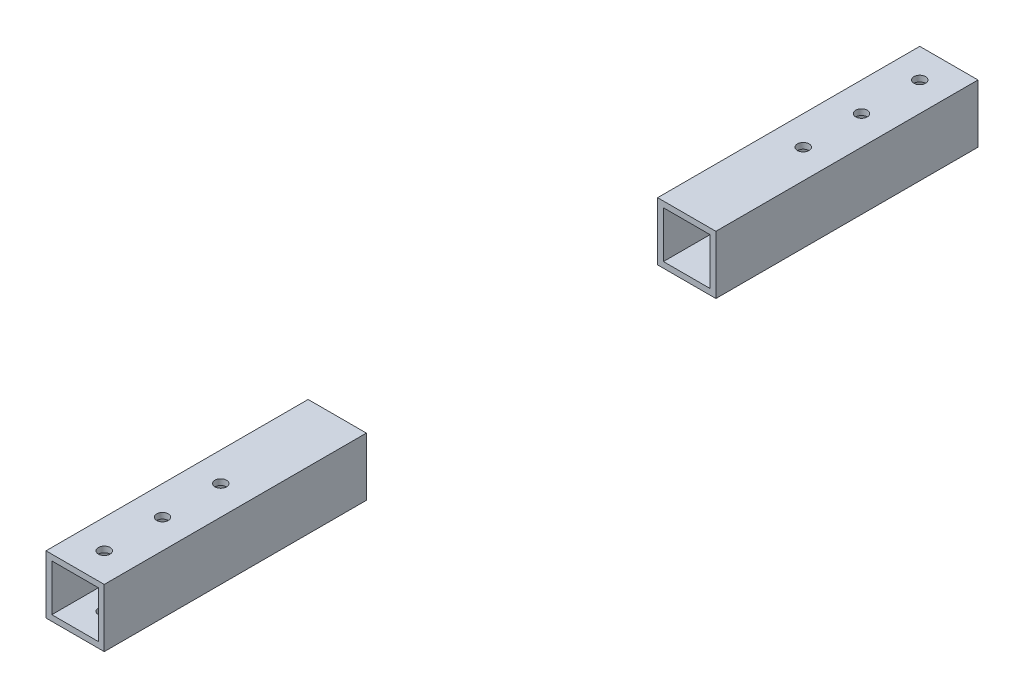
ISO-10303-21;
HEADER;
FILE_DESCRIPTION(('STEP AP214'),'2;1');
FILE_NAME('part.step','',(''),(''),'','','');
FILE_SCHEMA(('AUTOMOTIVE_DESIGN { 1 0 10303 214 1 1 1 1 }'));
ENDSEC;
DATA;
#1=APPLICATION_CONTEXT('core data for automotive mechanical design processes');
#2=APPLICATION_PROTOCOL_DEFINITION('international standard','automotive_design',2000,#1);
#3=PRODUCT_CONTEXT('',#1,'mechanical');
#4=PRODUCT('Part','Part','',(#3));
#5=PRODUCT_RELATED_PRODUCT_CATEGORY('part','',(#4));
#6=PRODUCT_DEFINITION_FORMATION('','',#4);
#7=PRODUCT_DEFINITION_CONTEXT('part definition',#1,'design');
#8=PRODUCT_DEFINITION('design','',#6,#7);
#9=PRODUCT_DEFINITION_SHAPE('','',#8);
#10=(LENGTH_UNIT() NAMED_UNIT(*) SI_UNIT(.MILLI.,.METRE.));
#11=(NAMED_UNIT(*) PLANE_ANGLE_UNIT() SI_UNIT($,.RADIAN.));
#12=(NAMED_UNIT(*) SI_UNIT($,.STERADIAN.) SOLID_ANGLE_UNIT());
#13=UNCERTAINTY_MEASURE_WITH_UNIT(LENGTH_MEASURE(1.E-05),#10,'distance_accuracy_value','');
#14=(GEOMETRIC_REPRESENTATION_CONTEXT(3) GLOBAL_UNCERTAINTY_ASSIGNED_CONTEXT((#13)) GLOBAL_UNIT_ASSIGNED_CONTEXT((#10,
#11,#12)) REPRESENTATION_CONTEXT('',''));
#15=CARTESIAN_POINT('',(0.,0.,0.));
#16=DIRECTION('',(0.,0.,1.));
#17=DIRECTION('',(1.,0.,0.));
#18=AXIS2_PLACEMENT_3D('',#15,#16,#17);
#19=CARTESIAN_POINT('',(0.,0.,300.));
#20=DIRECTION('',(1.,0.,0.));
#21=DIRECTION('',(0.,0.,-1.));
#22=AXIS2_PLACEMENT_3D('',#19,#20,#21);
#23=PLANE('',#22);
#24=DIRECTION('',(0.,0.,-1.));
#25=VECTOR('',#24,1.);
#26=CARTESIAN_POINT('',(0.,0.,300.));
#27=LINE('',#26,#25);
#28=CARTESIAN_POINT('',(0.,0.,90.));
#29=VERTEX_POINT('',#28);
#30=CARTESIAN_POINT('',(0.,0.,0.));
#31=VERTEX_POINT('',#30);
#32=EDGE_CURVE('E152',#29,#31,#27,.T.);
#33=ORIENTED_EDGE('',*,*,#32,.F.);
#34=DIRECTION('',(0.,1.,0.));
#35=VECTOR('',#34,1.);
#36=CARTESIAN_POINT('',(0.,0.,90.));
#37=LINE('',#36,#35);
#38=CARTESIAN_POINT('',(0.,20.,90.));
#39=VERTEX_POINT('',#38);
#40=EDGE_CURVE('E139',#29,#39,#37,.T.);
#41=ORIENTED_EDGE('',*,*,#40,.T.);
#42=DIRECTION('',(0.,0.,-1.));
#43=VECTOR('',#42,1.);
#44=CARTESIAN_POINT('',(0.,20.,300.));
#45=LINE('',#44,#43);
#46=CARTESIAN_POINT('',(0.,20.,0.));
#47=VERTEX_POINT('',#46);
#48=EDGE_CURVE('E146',#39,#47,#45,.T.);
#49=ORIENTED_EDGE('',*,*,#48,.T.);
#50=DIRECTION('',(0.,-1.,0.));
#51=VECTOR('',#50,1.);
#52=CARTESIAN_POINT('',(0.,0.,0.));
#53=LINE('',#52,#51);
#54=EDGE_CURVE('E159',#47,#31,#53,.T.);
#55=ORIENTED_EDGE('',*,*,#54,.T.);
#56=EDGE_LOOP('',(#33,#41,#49,#55));
#57=FACE_BOUND('',#56,.T.);
#58=ADVANCED_FACE('F80',(#57),#23,.F.);
#59=CARTESIAN_POINT('',(0.,0.,300.));
#60=DIRECTION('',(0.,1.,0.));
#61=DIRECTION('',(0.,0.,1.));
#62=AXIS2_PLACEMENT_3D('',#59,#60,#61);
#63=PLANE('',#62);
#64=CARTESIAN_POINT('',(10.,0.,10.));
#65=DIRECTION('',(0.,1.,0.));
#66=DIRECTION('',(0.,0.,-1.));
#67=AXIS2_PLACEMENT_3D('',#64,#65,#66);
#68=CIRCLE('',#67,2.);
#69=CARTESIAN_POINT('',(10.,0.,8.00000000000001));
#70=VERTEX_POINT('',#69);
#71=EDGE_CURVE('E209',#70,#70,#68,.T.);
#72=ORIENTED_EDGE('',*,*,#71,.T.);
#73=EDGE_LOOP('',(#72));
#74=FACE_BOUND('',#73,.T.);
#75=CARTESIAN_POINT('',(10.,0.,30.));
#76=DIRECTION('',(0.,1.,0.));
#77=DIRECTION('',(0.,0.,-1.));
#78=AXIS2_PLACEMENT_3D('',#75,#76,#77);
#79=CIRCLE('',#78,2.);
#80=CARTESIAN_POINT('',(10.,0.,28.));
#81=VERTEX_POINT('',#80);
#82=EDGE_CURVE('E206',#81,#81,#79,.T.);
#83=ORIENTED_EDGE('',*,*,#82,.T.);
#84=EDGE_LOOP('',(#83));
#85=FACE_BOUND('',#84,.T.);
#86=CARTESIAN_POINT('',(10.,0.,50.));
#87=DIRECTION('',(0.,1.,0.));
#88=DIRECTION('',(0.,0.,-1.));
#89=AXIS2_PLACEMENT_3D('',#86,#87,#88);
#90=CIRCLE('',#89,2.);
#91=CARTESIAN_POINT('',(10.,0.,48.));
#92=VERTEX_POINT('',#91);
#93=EDGE_CURVE('E155',#92,#92,#90,.T.);
#94=ORIENTED_EDGE('',*,*,#93,.T.);
#95=EDGE_LOOP('',(#94));
#96=FACE_BOUND('',#95,.T.);
#97=DIRECTION('',(0.,0.,-1.));
#98=VECTOR('',#97,1.);
#99=CARTESIAN_POINT('',(20.,0.,300.));
#100=LINE('',#99,#98);
#101=CARTESIAN_POINT('',(20.,0.,90.));
#102=VERTEX_POINT('',#101);
#103=CARTESIAN_POINT('',(20.,0.,0.));
#104=VERTEX_POINT('',#103);
#105=EDGE_CURVE('E154',#102,#104,#100,.T.);
#106=ORIENTED_EDGE('',*,*,#105,.F.);
#107=DIRECTION('',(-1.,0.,0.));
#108=VECTOR('',#107,1.);
#109=CARTESIAN_POINT('',(0.,0.,90.));
#110=LINE('',#109,#108);
#111=EDGE_CURVE('E142',#102,#29,#110,.T.);
#112=ORIENTED_EDGE('',*,*,#111,.T.);
#113=ORIENTED_EDGE('',*,*,#32,.T.);
#114=DIRECTION('',(1.,0.,0.));
#115=VECTOR('',#114,1.);
#116=CARTESIAN_POINT('',(0.,0.,0.));
#117=LINE('',#116,#115);
#118=EDGE_CURVE('E160',#31,#104,#117,.T.);
#119=ORIENTED_EDGE('',*,*,#118,.T.);
#120=EDGE_LOOP('',(#106,#112,#113,#119));
#121=FACE_BOUND('',#120,.T.);
#122=ADVANCED_FACE('F150',(#74,#85,#96,#121),#63,.F.);
#123=CARTESIAN_POINT('',(20.,0.,300.));
#124=DIRECTION('',(-1.,0.,0.));
#125=DIRECTION('',(0.,0.,1.));
#126=AXIS2_PLACEMENT_3D('',#123,#124,#125);
#127=PLANE('',#126);
#128=DIRECTION('',(0.,0.,-1.));
#129=VECTOR('',#128,1.);
#130=CARTESIAN_POINT('',(20.,20.,300.));
#131=LINE('',#130,#129);
#132=CARTESIAN_POINT('',(20.,20.,90.));
#133=VERTEX_POINT('',#132);
#134=CARTESIAN_POINT('',(20.,20.,0.));
#135=VERTEX_POINT('',#134);
#136=EDGE_CURVE('E167',#133,#135,#131,.T.);
#137=ORIENTED_EDGE('',*,*,#136,.F.);
#138=DIRECTION('',(0.,1.,0.));
#139=VECTOR('',#138,1.);
#140=CARTESIAN_POINT('',(20.,0.,90.));
#141=LINE('',#140,#139);
#142=EDGE_CURVE('E13',#102,#133,#141,.T.);
#143=ORIENTED_EDGE('',*,*,#142,.F.);
#144=ORIENTED_EDGE('',*,*,#105,.T.);
#145=DIRECTION('',(0.,1.,0.));
#146=VECTOR('',#145,1.);
#147=CARTESIAN_POINT('',(20.,0.,0.));
#148=LINE('',#147,#146);
#149=EDGE_CURVE('E166',#104,#135,#148,.T.);
#150=ORIENTED_EDGE('',*,*,#149,.T.);
#151=EDGE_LOOP('',(#137,#143,#144,#150));
#152=FACE_BOUND('',#151,.T.);
#153=ADVANCED_FACE('F264',(#152),#127,.F.);
#154=CARTESIAN_POINT('',(0.,20.,300.));
#155=DIRECTION('',(0.,-1.,0.));
#156=DIRECTION('',(0.,0.,-1.));
#157=AXIS2_PLACEMENT_3D('',#154,#155,#156);
#158=PLANE('',#157);
#159=CARTESIAN_POINT('',(10.,20.,10.));
#160=DIRECTION('',(0.,1.,0.));
#161=DIRECTION('',(0.,0.,-1.));
#162=AXIS2_PLACEMENT_3D('',#159,#160,#161);
#163=CIRCLE('',#162,2.);
#164=CARTESIAN_POINT('',(10.,20.,8.00000000000001));
#165=VERTEX_POINT('',#164);
#166=EDGE_CURVE('E217',#165,#165,#163,.T.);
#167=ORIENTED_EDGE('',*,*,#166,.F.);
#168=EDGE_LOOP('',(#167));
#169=FACE_BOUND('',#168,.T.);
#170=CARTESIAN_POINT('',(10.,20.,30.));
#171=DIRECTION('',(0.,1.,0.));
#172=DIRECTION('',(0.,0.,-1.));
#173=AXIS2_PLACEMENT_3D('',#170,#171,#172);
#174=CIRCLE('',#173,2.);
#175=CARTESIAN_POINT('',(10.,20.,28.));
#176=VERTEX_POINT('',#175);
#177=EDGE_CURVE('E210',#176,#176,#174,.T.);
#178=ORIENTED_EDGE('',*,*,#177,.F.);
#179=EDGE_LOOP('',(#178));
#180=FACE_BOUND('',#179,.T.);
#181=CARTESIAN_POINT('',(10.,20.,50.));
#182=DIRECTION('',(0.,1.,0.));
#183=DIRECTION('',(0.,0.,-1.));
#184=AXIS2_PLACEMENT_3D('',#181,#182,#183);
#185=CIRCLE('',#184,2.);
#186=CARTESIAN_POINT('',(10.,20.,48.));
#187=VERTEX_POINT('',#186);
#188=EDGE_CURVE('E205',#187,#187,#185,.T.);
#189=ORIENTED_EDGE('',*,*,#188,.F.);
#190=EDGE_LOOP('',(#189));
#191=FACE_BOUND('',#190,.T.);
#192=ORIENTED_EDGE('',*,*,#48,.F.);
#193=DIRECTION('',(-1.,0.,0.));
#194=VECTOR('',#193,1.);
#195=CARTESIAN_POINT('',(0.,20.,90.));
#196=LINE('',#195,#194);
#197=EDGE_CURVE('E90',#133,#39,#196,.T.);
#198=ORIENTED_EDGE('',*,*,#197,.F.);
#199=ORIENTED_EDGE('',*,*,#136,.T.);
#200=DIRECTION('',(-1.,0.,0.));
#201=VECTOR('',#200,1.);
#202=CARTESIAN_POINT('',(0.,20.,0.));
#203=LINE('',#202,#201);
#204=EDGE_CURVE('E169',#135,#47,#203,.T.);
#205=ORIENTED_EDGE('',*,*,#204,.T.);
#206=EDGE_LOOP('',(#192,#198,#199,#205));
#207=FACE_BOUND('',#206,.T.);
#208=ADVANCED_FACE('F258',(#169,#180,#191,#207),#158,.F.);
#209=CARTESIAN_POINT('',(2.,0.,300.));
#210=DIRECTION('',(1.,0.,0.));
#211=DIRECTION('',(0.,0.,-1.));
#212=AXIS2_PLACEMENT_3D('',#209,#210,#211);
#213=PLANE('',#212);
#214=DIRECTION('',(0.,1.,0.));
#215=VECTOR('',#214,1.);
#216=CARTESIAN_POINT('',(2.,0.,90.));
#217=LINE('',#216,#215);
#218=CARTESIAN_POINT('',(2.,2.,90.));
#219=VERTEX_POINT('',#218);
#220=CARTESIAN_POINT('',(2.,18.,90.));
#221=VERTEX_POINT('',#220);
#222=EDGE_CURVE('E198',#219,#221,#217,.T.);
#223=ORIENTED_EDGE('',*,*,#222,.F.);
#224=DIRECTION('',(0.,0.,-1.));
#225=VECTOR('',#224,1.);
#226=CARTESIAN_POINT('',(2.,2.,300.));
#227=LINE('',#226,#225);
#228=CARTESIAN_POINT('',(2.,2.,0.));
#229=VERTEX_POINT('',#228);
#230=EDGE_CURVE('E171',#219,#229,#227,.T.);
#231=ORIENTED_EDGE('',*,*,#230,.T.);
#232=DIRECTION('',(0.,-1.,0.));
#233=VECTOR('',#232,1.);
#234=CARTESIAN_POINT('',(2.,0.,0.));
#235=LINE('',#234,#233);
#236=CARTESIAN_POINT('',(2.,18.,0.));
#237=VERTEX_POINT('',#236);
#238=EDGE_CURVE('E180',#237,#229,#235,.T.);
#239=ORIENTED_EDGE('',*,*,#238,.F.);
#240=DIRECTION('',(0.,0.,-1.));
#241=VECTOR('',#240,1.);
#242=CARTESIAN_POINT('',(2.,18.,300.));
#243=LINE('',#242,#241);
#244=EDGE_CURVE('E84',#221,#237,#243,.T.);
#245=ORIENTED_EDGE('',*,*,#244,.F.);
#246=EDGE_LOOP('',(#223,#231,#239,#245));
#247=FACE_BOUND('',#246,.T.);
#248=ADVANCED_FACE('F82',(#247),#213,.T.);
#249=CARTESIAN_POINT('',(0.,2.,300.));
#250=DIRECTION('',(0.,1.,0.));
#251=DIRECTION('',(0.,0.,1.));
#252=AXIS2_PLACEMENT_3D('',#249,#250,#251);
#253=PLANE('',#252);
#254=DIRECTION('',(-1.,0.,0.));
#255=VECTOR('',#254,1.);
#256=CARTESIAN_POINT('',(0.,2.,90.));
#257=LINE('',#256,#255);
#258=CARTESIAN_POINT('',(18.,2.,90.));
#259=VERTEX_POINT('',#258);
#260=EDGE_CURVE('E227',#259,#219,#257,.T.);
#261=ORIENTED_EDGE('',*,*,#260,.F.);
#262=DIRECTION('',(0.,0.,-1.));
#263=VECTOR('',#262,1.);
#264=CARTESIAN_POINT('',(18.,2.,300.));
#265=LINE('',#264,#263);
#266=CARTESIAN_POINT('',(18.,2.,0.));
#267=VERTEX_POINT('',#266);
#268=EDGE_CURVE('E173',#259,#267,#265,.T.);
#269=ORIENTED_EDGE('',*,*,#268,.T.);
#270=DIRECTION('',(1.,0.,0.));
#271=VECTOR('',#270,1.);
#272=CARTESIAN_POINT('',(0.,2.,0.));
#273=LINE('',#272,#271);
#274=EDGE_CURVE('E186',#229,#267,#273,.T.);
#275=ORIENTED_EDGE('',*,*,#274,.F.);
#276=ORIENTED_EDGE('',*,*,#230,.F.);
#277=EDGE_LOOP('',(#261,#269,#275,#276));
#278=FACE_BOUND('',#277,.T.);
#279=CARTESIAN_POINT('',(10.,2.,10.));
#280=DIRECTION('',(0.,1.,0.));
#281=DIRECTION('',(0.,0.,1.));
#282=AXIS2_PLACEMENT_3D('',#279,#280,#281);
#283=CIRCLE('',#282,2.);
#284=CARTESIAN_POINT('',(10.,2.,12.));
#285=VERTEX_POINT('',#284);
#286=EDGE_CURVE('E202',#285,#285,#283,.T.);
#287=ORIENTED_EDGE('',*,*,#286,.F.);
#288=EDGE_LOOP('',(#287));
#289=FACE_BOUND('',#288,.T.);
#290=CARTESIAN_POINT('',(10.,2.,30.));
#291=DIRECTION('',(0.,1.,0.));
#292=DIRECTION('',(0.,0.,1.));
#293=AXIS2_PLACEMENT_3D('',#290,#291,#292);
#294=CIRCLE('',#293,2.);
#295=CARTESIAN_POINT('',(10.,2.,32.));
#296=VERTEX_POINT('',#295);
#297=EDGE_CURVE('E199',#296,#296,#294,.T.);
#298=ORIENTED_EDGE('',*,*,#297,.F.);
#299=EDGE_LOOP('',(#298));
#300=FACE_BOUND('',#299,.T.);
#301=CARTESIAN_POINT('',(10.,2.,50.));
#302=DIRECTION('',(0.,1.,0.));
#303=DIRECTION('',(0.,0.,1.));
#304=AXIS2_PLACEMENT_3D('',#301,#302,#303);
#305=CIRCLE('',#304,2.);
#306=CARTESIAN_POINT('',(10.,2.,52.));
#307=VERTEX_POINT('',#306);
#308=EDGE_CURVE('E195',#307,#307,#305,.T.);
#309=ORIENTED_EDGE('',*,*,#308,.F.);
#310=EDGE_LOOP('',(#309));
#311=FACE_BOUND('',#310,.T.);
#312=ADVANCED_FACE('F252',(#278,#289,#300,#311),#253,.T.);
#313=CARTESIAN_POINT('',(18.,0.,300.));
#314=DIRECTION('',(-1.,0.,0.));
#315=DIRECTION('',(0.,0.,1.));
#316=AXIS2_PLACEMENT_3D('',#313,#314,#315);
#317=PLANE('',#316);
#318=DIRECTION('',(0.,-1.,0.));
#319=VECTOR('',#318,1.);
#320=CARTESIAN_POINT('',(18.,0.,90.));
#321=LINE('',#320,#319);
#322=CARTESIAN_POINT('',(18.,18.,90.));
#323=VERTEX_POINT('',#322);
#324=EDGE_CURVE('E229',#323,#259,#321,.T.);
#325=ORIENTED_EDGE('',*,*,#324,.F.);
#326=DIRECTION('',(0.,0.,-1.));
#327=VECTOR('',#326,1.);
#328=CARTESIAN_POINT('',(18.,18.,300.));
#329=LINE('',#328,#327);
#330=CARTESIAN_POINT('',(18.,18.,0.));
#331=VERTEX_POINT('',#330);
#332=EDGE_CURVE('E174',#323,#331,#329,.T.);
#333=ORIENTED_EDGE('',*,*,#332,.T.);
#334=DIRECTION('',(0.,1.,0.));
#335=VECTOR('',#334,1.);
#336=CARTESIAN_POINT('',(18.,0.,0.));
#337=LINE('',#336,#335);
#338=EDGE_CURVE('E191',#267,#331,#337,.T.);
#339=ORIENTED_EDGE('',*,*,#338,.F.);
#340=ORIENTED_EDGE('',*,*,#268,.F.);
#341=EDGE_LOOP('',(#325,#333,#339,#340));
#342=FACE_BOUND('',#341,.T.);
#343=ADVANCED_FACE('F250',(#342),#317,.T.);
#344=CARTESIAN_POINT('',(0.,18.,300.));
#345=DIRECTION('',(0.,-1.,0.));
#346=DIRECTION('',(0.,0.,-1.));
#347=AXIS2_PLACEMENT_3D('',#344,#345,#346);
#348=PLANE('',#347);
#349=DIRECTION('',(1.,0.,0.));
#350=VECTOR('',#349,1.);
#351=CARTESIAN_POINT('',(0.,18.,90.));
#352=LINE('',#351,#350);
#353=EDGE_CURVE('E226',#221,#323,#352,.T.);
#354=ORIENTED_EDGE('',*,*,#353,.F.);
#355=ORIENTED_EDGE('',*,*,#244,.T.);
#356=DIRECTION('',(-1.,0.,0.));
#357=VECTOR('',#356,1.);
#358=CARTESIAN_POINT('',(0.,18.,0.));
#359=LINE('',#358,#357);
#360=EDGE_CURVE('E240',#331,#237,#359,.T.);
#361=ORIENTED_EDGE('',*,*,#360,.F.);
#362=ORIENTED_EDGE('',*,*,#332,.F.);
#363=EDGE_LOOP('',(#354,#355,#361,#362));
#364=FACE_BOUND('',#363,.T.);
#365=CARTESIAN_POINT('',(10.,18.,10.));
#366=DIRECTION('',(0.,-1.,0.));
#367=DIRECTION('',(0.,0.,-1.));
#368=AXIS2_PLACEMENT_3D('',#365,#366,#367);
#369=CIRCLE('',#368,2.);
#370=CARTESIAN_POINT('',(10.,18.,8.00000000000001));
#371=VERTEX_POINT('',#370);
#372=EDGE_CURVE('E220',#371,#371,#369,.T.);
#373=ORIENTED_EDGE('',*,*,#372,.F.);
#374=EDGE_LOOP('',(#373));
#375=FACE_BOUND('',#374,.T.);
#376=CARTESIAN_POINT('',(10.,18.,30.));
#377=DIRECTION('',(0.,-1.,0.));
#378=DIRECTION('',(0.,0.,-1.));
#379=AXIS2_PLACEMENT_3D('',#376,#377,#378);
#380=CIRCLE('',#379,2.);
#381=CARTESIAN_POINT('',(10.,18.,28.));
#382=VERTEX_POINT('',#381);
#383=EDGE_CURVE('E214',#382,#382,#380,.T.);
#384=ORIENTED_EDGE('',*,*,#383,.F.);
#385=EDGE_LOOP('',(#384));
#386=FACE_BOUND('',#385,.T.);
#387=CARTESIAN_POINT('',(10.,18.,50.));
#388=DIRECTION('',(0.,-1.,0.));
#389=DIRECTION('',(0.,0.,-1.));
#390=AXIS2_PLACEMENT_3D('',#387,#388,#389);
#391=CIRCLE('',#390,2.);
#392=CARTESIAN_POINT('',(10.,18.,48.));
#393=VERTEX_POINT('',#392);
#394=EDGE_CURVE('E213',#393,#393,#391,.T.);
#395=ORIENTED_EDGE('',*,*,#394,.F.);
#396=EDGE_LOOP('',(#395));
#397=FACE_BOUND('',#396,.T.);
#398=ADVANCED_FACE('F276',(#364,#375,#386,#397),#348,.T.);
#399=CARTESIAN_POINT('',(0.,0.,0.));
#400=DIRECTION('',(0.,0.,1.));
#401=DIRECTION('',(1.,0.,0.));
#402=AXIS2_PLACEMENT_3D('',#399,#400,#401);
#403=PLANE('',#402);
#404=ORIENTED_EDGE('',*,*,#54,.F.);
#405=ORIENTED_EDGE('',*,*,#204,.F.);
#406=ORIENTED_EDGE('',*,*,#149,.F.);
#407=ORIENTED_EDGE('',*,*,#118,.F.);
#408=EDGE_LOOP('',(#404,#405,#406,#407));
#409=FACE_BOUND('',#408,.T.);
#410=ORIENTED_EDGE('',*,*,#238,.T.);
#411=ORIENTED_EDGE('',*,*,#274,.T.);
#412=ORIENTED_EDGE('',*,*,#338,.T.);
#413=ORIENTED_EDGE('',*,*,#360,.T.);
#414=EDGE_LOOP('',(#410,#411,#412,#413));
#415=FACE_BOUND('',#414,.T.);
#416=ADVANCED_FACE('F247',(#409,#415),#403,.F.);
#417=CARTESIAN_POINT('',(10.,0.,10.));
#418=DIRECTION('',(0.,1.,0.));
#419=DIRECTION('',(0.,0.,1.));
#420=AXIS2_PLACEMENT_3D('',#417,#418,#419);
#421=CYLINDRICAL_SURFACE('',#420,2.);
#422=ORIENTED_EDGE('',*,*,#372,.T.);
#423=EDGE_LOOP('',(#422));
#424=FACE_BOUND('',#423,.T.);
#425=ORIENTED_EDGE('',*,*,#166,.T.);
#426=EDGE_LOOP('',(#425));
#427=FACE_BOUND('',#426,.T.);
#428=ADVANCED_FACE('F295',(#424,#427),#421,.F.);
#429=CARTESIAN_POINT('',(10.,0.,30.));
#430=DIRECTION('',(0.,1.,0.));
#431=DIRECTION('',(0.,0.,1.));
#432=AXIS2_PLACEMENT_3D('',#429,#430,#431);
#433=CYLINDRICAL_SURFACE('',#432,2.);
#434=ORIENTED_EDGE('',*,*,#383,.T.);
#435=EDGE_LOOP('',(#434));
#436=FACE_BOUND('',#435,.T.);
#437=ORIENTED_EDGE('',*,*,#177,.T.);
#438=EDGE_LOOP('',(#437));
#439=FACE_BOUND('',#438,.T.);
#440=ADVANCED_FACE('F303',(#436,#439),#433,.F.);
#441=CARTESIAN_POINT('',(10.,0.,50.));
#442=DIRECTION('',(0.,1.,0.));
#443=DIRECTION('',(0.,0.,1.));
#444=AXIS2_PLACEMENT_3D('',#441,#442,#443);
#445=CYLINDRICAL_SURFACE('',#444,2.);
#446=ORIENTED_EDGE('',*,*,#394,.T.);
#447=EDGE_LOOP('',(#446));
#448=FACE_BOUND('',#447,.T.);
#449=ORIENTED_EDGE('',*,*,#188,.T.);
#450=EDGE_LOOP('',(#449));
#451=FACE_BOUND('',#450,.T.);
#452=ADVANCED_FACE('F314',(#448,#451),#445,.F.);
#453=ORIENTED_EDGE('',*,*,#286,.T.);
#454=EDGE_LOOP('',(#453));
#455=FACE_BOUND('',#454,.T.);
#456=ORIENTED_EDGE('',*,*,#71,.F.);
#457=EDGE_LOOP('',(#456));
#458=FACE_BOUND('',#457,.T.);
#459=ADVANCED_FACE('F306',(#455,#458),#421,.F.);
#460=ORIENTED_EDGE('',*,*,#297,.T.);
#461=EDGE_LOOP('',(#460));
#462=FACE_BOUND('',#461,.T.);
#463=ORIENTED_EDGE('',*,*,#82,.F.);
#464=EDGE_LOOP('',(#463));
#465=FACE_BOUND('',#464,.T.);
#466=ADVANCED_FACE('F317',(#462,#465),#433,.F.);
#467=ORIENTED_EDGE('',*,*,#308,.T.);
#468=EDGE_LOOP('',(#467));
#469=FACE_BOUND('',#468,.T.);
#470=ORIENTED_EDGE('',*,*,#93,.F.);
#471=EDGE_LOOP('',(#470));
#472=FACE_BOUND('',#471,.T.);
#473=ADVANCED_FACE('F326',(#469,#472),#445,.F.);
#474=CARTESIAN_POINT('',(0.,0.,90.));
#475=DIRECTION('',(0.,0.,-1.));
#476=DIRECTION('',(-1.,0.,0.));
#477=AXIS2_PLACEMENT_3D('',#474,#475,#476);
#478=PLANE('',#477);
#479=ORIENTED_EDGE('',*,*,#222,.T.);
#480=ORIENTED_EDGE('',*,*,#353,.T.);
#481=ORIENTED_EDGE('',*,*,#324,.T.);
#482=ORIENTED_EDGE('',*,*,#260,.T.);
#483=EDGE_LOOP('',(#479,#480,#481,#482));
#484=FACE_BOUND('',#483,.T.);
#485=ORIENTED_EDGE('',*,*,#197,.T.);
#486=ORIENTED_EDGE('',*,*,#40,.F.);
#487=ORIENTED_EDGE('',*,*,#111,.F.);
#488=ORIENTED_EDGE('',*,*,#142,.T.);
#489=EDGE_LOOP('',(#485,#486,#487,#488));
#490=FACE_BOUND('',#489,.T.);
#491=ADVANCED_FACE('F141',(#484,#490),#478,.F.);
#492=CLOSED_SHELL('',(#58,#122,#153,#208,#248,#312,#343,#398,#416,#428,#440,#452,#459,#466,#473,#491));
#493=MANIFOLD_SOLID_BREP('B2',#492);
#494=CARTESIAN_POINT('',(10.,0.,270.));
#495=DIRECTION('',(0.,1.,0.));
#496=DIRECTION('',(0.,0.,1.));
#497=AXIS2_PLACEMENT_3D('',#494,#495,#496);
#498=CYLINDRICAL_SURFACE('',#497,2.);
#499=CARTESIAN_POINT('',(10.,2.,270.));
#500=DIRECTION('',(0.,1.,0.));
#501=DIRECTION('',(0.,0.,1.));
#502=AXIS2_PLACEMENT_3D('',#499,#500,#501);
#503=CIRCLE('',#502,2.);
#504=CARTESIAN_POINT('',(10.,2.,272.));
#505=VERTEX_POINT('',#504);
#506=EDGE_CURVE('E534',#505,#505,#503,.T.);
#507=ORIENTED_EDGE('',*,*,#506,.T.);
#508=EDGE_LOOP('',(#507));
#509=FACE_BOUND('',#508,.T.);
#510=CARTESIAN_POINT('',(10.,0.,270.));
#511=DIRECTION('',(0.,1.,0.));
#512=DIRECTION('',(0.,0.,1.));
#513=AXIS2_PLACEMENT_3D('',#510,#511,#512);
#514=CIRCLE('',#513,2.);
#515=CARTESIAN_POINT('',(10.,0.,272.));
#516=VERTEX_POINT('',#515);
#517=EDGE_CURVE('E606',#516,#516,#514,.T.);
#518=ORIENTED_EDGE('',*,*,#517,.F.);
#519=EDGE_LOOP('',(#518));
#520=FACE_BOUND('',#519,.T.);
#521=ADVANCED_FACE('F443',(#509,#520),#498,.F.);
#522=CARTESIAN_POINT('',(10.,0.,250.));
#523=DIRECTION('',(0.,1.,0.));
#524=DIRECTION('',(0.,0.,1.));
#525=AXIS2_PLACEMENT_3D('',#522,#523,#524);
#526=CYLINDRICAL_SURFACE('',#525,2.);
#527=CARTESIAN_POINT('',(10.,2.,250.));
#528=DIRECTION('',(0.,1.,0.));
#529=DIRECTION('',(0.,0.,1.));
#530=AXIS2_PLACEMENT_3D('',#527,#528,#529);
#531=CIRCLE('',#530,2.);
#532=CARTESIAN_POINT('',(10.,2.,252.));
#533=VERTEX_POINT('',#532);
#534=EDGE_CURVE('E538',#533,#533,#531,.T.);
#535=ORIENTED_EDGE('',*,*,#534,.T.);
#536=EDGE_LOOP('',(#535));
#537=FACE_BOUND('',#536,.T.);
#538=CARTESIAN_POINT('',(10.,0.,250.));
#539=DIRECTION('',(0.,1.,0.));
#540=DIRECTION('',(0.,0.,1.));
#541=AXIS2_PLACEMENT_3D('',#538,#539,#540);
#542=CIRCLE('',#541,2.);
#543=CARTESIAN_POINT('',(10.,0.,252.));
#544=VERTEX_POINT('',#543);
#545=EDGE_CURVE('E597',#544,#544,#542,.T.);
#546=ORIENTED_EDGE('',*,*,#545,.F.);
#547=EDGE_LOOP('',(#546));
#548=FACE_BOUND('',#547,.T.);
#549=ADVANCED_FACE('F616',(#537,#548),#526,.F.);
#550=CARTESIAN_POINT('',(10.,0.,290.));
#551=DIRECTION('',(0.,1.,0.));
#552=DIRECTION('',(0.,0.,1.));
#553=AXIS2_PLACEMENT_3D('',#550,#551,#552);
#554=CYLINDRICAL_SURFACE('',#553,2.);
#555=CARTESIAN_POINT('',(10.,2.,290.));
#556=DIRECTION('',(0.,1.,0.));
#557=DIRECTION('',(0.,0.,1.));
#558=AXIS2_PLACEMENT_3D('',#555,#556,#557);
#559=CIRCLE('',#558,2.);
#560=CARTESIAN_POINT('',(10.,2.,292.));
#561=VERTEX_POINT('',#560);
#562=EDGE_CURVE('E541',#561,#561,#559,.T.);
#563=ORIENTED_EDGE('',*,*,#562,.T.);
#564=EDGE_LOOP('',(#563));
#565=FACE_BOUND('',#564,.T.);
#566=CARTESIAN_POINT('',(10.,0.,290.));
#567=DIRECTION('',(0.,1.,0.));
#568=DIRECTION('',(0.,0.,1.));
#569=AXIS2_PLACEMENT_3D('',#566,#567,#568);
#570=CIRCLE('',#569,2.);
#571=CARTESIAN_POINT('',(10.,0.,292.));
#572=VERTEX_POINT('',#571);
#573=EDGE_CURVE('E535',#572,#572,#570,.T.);
#574=ORIENTED_EDGE('',*,*,#573,.F.);
#575=EDGE_LOOP('',(#574));
#576=FACE_BOUND('',#575,.T.);
#577=ADVANCED_FACE('F618',(#565,#576),#554,.F.);
#578=CARTESIAN_POINT('',(10.,18.,270.));
#579=DIRECTION('',(0.,-1.,0.));
#580=DIRECTION('',(0.,0.,-1.));
#581=AXIS2_PLACEMENT_3D('',#578,#579,#580);
#582=CIRCLE('',#581,2.);
#583=CARTESIAN_POINT('',(10.,18.,268.));
#584=VERTEX_POINT('',#583);
#585=EDGE_CURVE('E531',#584,#584,#582,.T.);
#586=ORIENTED_EDGE('',*,*,#585,.T.);
#587=EDGE_LOOP('',(#586));
#588=FACE_BOUND('',#587,.T.);
#589=CARTESIAN_POINT('',(10.,20.,270.));
#590=DIRECTION('',(0.,1.,0.));
#591=DIRECTION('',(0.,0.,1.));
#592=AXIS2_PLACEMENT_3D('',#589,#590,#591);
#593=CIRCLE('',#592,2.);
#594=CARTESIAN_POINT('',(10.,20.,272.));
#595=VERTEX_POINT('',#594);
#596=EDGE_CURVE('E603',#595,#595,#593,.T.);
#597=ORIENTED_EDGE('',*,*,#596,.T.);
#598=EDGE_LOOP('',(#597));
#599=FACE_BOUND('',#598,.T.);
#600=ADVANCED_FACE('F625',(#588,#599),#498,.F.);
#601=CARTESIAN_POINT('',(10.,18.,250.));
#602=DIRECTION('',(0.,-1.,0.));
#603=DIRECTION('',(0.,0.,-1.));
#604=AXIS2_PLACEMENT_3D('',#601,#602,#603);
#605=CIRCLE('',#604,2.);
#606=CARTESIAN_POINT('',(10.,18.,248.));
#607=VERTEX_POINT('',#606);
#608=EDGE_CURVE('E536',#607,#607,#605,.T.);
#609=ORIENTED_EDGE('',*,*,#608,.T.);
#610=EDGE_LOOP('',(#609));
#611=FACE_BOUND('',#610,.T.);
#612=CARTESIAN_POINT('',(10.,20.,250.));
#613=DIRECTION('',(0.,1.,0.));
#614=DIRECTION('',(0.,0.,1.));
#615=AXIS2_PLACEMENT_3D('',#612,#613,#614);
#616=CIRCLE('',#615,2.);
#617=CARTESIAN_POINT('',(10.,20.,252.));
#618=VERTEX_POINT('',#617);
#619=EDGE_CURVE('E609',#618,#618,#616,.T.);
#620=ORIENTED_EDGE('',*,*,#619,.T.);
#621=EDGE_LOOP('',(#620));
#622=FACE_BOUND('',#621,.T.);
#623=ADVANCED_FACE('F620',(#611,#622),#526,.F.);
#624=CARTESIAN_POINT('',(10.,18.,290.));
#625=DIRECTION('',(0.,-1.,0.));
#626=DIRECTION('',(0.,0.,-1.));
#627=AXIS2_PLACEMENT_3D('',#624,#625,#626);
#628=CIRCLE('',#627,2.);
#629=CARTESIAN_POINT('',(10.,18.,288.));
#630=VERTEX_POINT('',#629);
#631=EDGE_CURVE('E539',#630,#630,#628,.T.);
#632=ORIENTED_EDGE('',*,*,#631,.T.);
#633=EDGE_LOOP('',(#632));
#634=FACE_BOUND('',#633,.T.);
#635=CARTESIAN_POINT('',(10.,20.,290.));
#636=DIRECTION('',(0.,1.,0.));
#637=DIRECTION('',(0.,0.,1.));
#638=AXIS2_PLACEMENT_3D('',#635,#636,#637);
#639=CIRCLE('',#638,2.);
#640=CARTESIAN_POINT('',(10.,20.,292.));
#641=VERTEX_POINT('',#640);
#642=EDGE_CURVE('E600',#641,#641,#639,.T.);
#643=ORIENTED_EDGE('',*,*,#642,.T.);
#644=EDGE_LOOP('',(#643));
#645=FACE_BOUND('',#644,.T.);
#646=ADVANCED_FACE('F628',(#634,#645),#554,.F.);
#647=CARTESIAN_POINT('',(0.,20.,300.));
#648=DIRECTION('',(0.,-1.,0.));
#649=DIRECTION('',(0.,0.,-1.));
#650=AXIS2_PLACEMENT_3D('',#647,#648,#649);
#651=PLANE('',#650);
#652=ORIENTED_EDGE('',*,*,#642,.F.);
#653=EDGE_LOOP('',(#652));
#654=FACE_BOUND('',#653,.T.);
#655=ORIENTED_EDGE('',*,*,#619,.F.);
#656=EDGE_LOOP('',(#655));
#657=FACE_BOUND('',#656,.T.);
#658=ORIENTED_EDGE('',*,*,#596,.F.);
#659=EDGE_LOOP('',(#658));
#660=FACE_BOUND('',#659,.T.);
#661=DIRECTION('',(0.,0.,-1.));
#662=VECTOR('',#661,1.);
#663=CARTESIAN_POINT('',(20.,20.,300.));
#664=LINE('',#663,#662);
#665=CARTESIAN_POINT('',(20.,20.,300.));
#666=VERTEX_POINT('',#665);
#667=CARTESIAN_POINT('',(20.,20.,210.));
#668=VERTEX_POINT('',#667);
#669=EDGE_CURVE('E527',#666,#668,#664,.T.);
#670=ORIENTED_EDGE('',*,*,#669,.T.);
#671=DIRECTION('',(1.,0.,0.));
#672=VECTOR('',#671,1.);
#673=CARTESIAN_POINT('',(0.,20.,210.));
#674=LINE('',#673,#672);
#675=CARTESIAN_POINT('',(0.,20.,210.));
#676=VERTEX_POINT('',#675);
#677=EDGE_CURVE('E513',#676,#668,#674,.T.);
#678=ORIENTED_EDGE('',*,*,#677,.F.);
#679=DIRECTION('',(0.,0.,-1.));
#680=VECTOR('',#679,1.);
#681=CARTESIAN_POINT('',(0.,20.,300.));
#682=LINE('',#681,#680);
#683=CARTESIAN_POINT('',(0.,20.,300.));
#684=VERTEX_POINT('',#683);
#685=EDGE_CURVE('E520',#684,#676,#682,.T.);
#686=ORIENTED_EDGE('',*,*,#685,.F.);
#687=DIRECTION('',(-1.,0.,0.));
#688=VECTOR('',#687,1.);
#689=CARTESIAN_POINT('',(0.,20.,300.));
#690=LINE('',#689,#688);
#691=EDGE_CURVE('E579',#666,#684,#690,.T.);
#692=ORIENTED_EDGE('',*,*,#691,.F.);
#693=EDGE_LOOP('',(#670,#678,#686,#692));
#694=FACE_BOUND('',#693,.T.);
#695=ADVANCED_FACE('F585',(#654,#657,#660,#694),#651,.F.);
#696=CARTESIAN_POINT('',(20.,0.,300.));
#697=DIRECTION('',(-1.,0.,0.));
#698=DIRECTION('',(0.,0.,1.));
#699=AXIS2_PLACEMENT_3D('',#696,#697,#698);
#700=PLANE('',#699);
#701=DIRECTION('',(0.,0.,-1.));
#702=VECTOR('',#701,1.);
#703=CARTESIAN_POINT('',(20.,0.,300.));
#704=LINE('',#703,#702);
#705=CARTESIAN_POINT('',(20.,0.,300.));
#706=VERTEX_POINT('',#705);
#707=CARTESIAN_POINT('',(20.,0.,210.));
#708=VERTEX_POINT('',#707);
#709=EDGE_CURVE('E525',#706,#708,#704,.T.);
#710=ORIENTED_EDGE('',*,*,#709,.T.);
#711=DIRECTION('',(0.,1.,0.));
#712=VECTOR('',#711,1.);
#713=CARTESIAN_POINT('',(20.,0.,210.));
#714=LINE('',#713,#712);
#715=EDGE_CURVE('E508',#708,#668,#714,.T.);
#716=ORIENTED_EDGE('',*,*,#715,.T.);
#717=ORIENTED_EDGE('',*,*,#669,.F.);
#718=DIRECTION('',(0.,1.,0.));
#719=VECTOR('',#718,1.);
#720=CARTESIAN_POINT('',(20.,0.,300.));
#721=LINE('',#720,#719);
#722=EDGE_CURVE('E577',#706,#666,#721,.T.);
#723=ORIENTED_EDGE('',*,*,#722,.F.);
#724=EDGE_LOOP('',(#710,#716,#717,#723));
#725=FACE_BOUND('',#724,.T.);
#726=ADVANCED_FACE('F588',(#725),#700,.F.);
#727=CARTESIAN_POINT('',(0.,0.,300.));
#728=DIRECTION('',(0.,1.,0.));
#729=DIRECTION('',(0.,0.,1.));
#730=AXIS2_PLACEMENT_3D('',#727,#728,#729);
#731=PLANE('',#730);
#732=ORIENTED_EDGE('',*,*,#573,.T.);
#733=EDGE_LOOP('',(#732));
#734=FACE_BOUND('',#733,.T.);
#735=ORIENTED_EDGE('',*,*,#545,.T.);
#736=EDGE_LOOP('',(#735));
#737=FACE_BOUND('',#736,.T.);
#738=ORIENTED_EDGE('',*,*,#517,.T.);
#739=EDGE_LOOP('',(#738));
#740=FACE_BOUND('',#739,.T.);
#741=DIRECTION('',(0.,0.,-1.));
#742=VECTOR('',#741,1.);
#743=CARTESIAN_POINT('',(0.,0.,300.));
#744=LINE('',#743,#742);
#745=CARTESIAN_POINT('',(0.,0.,300.));
#746=VERTEX_POINT('',#745);
#747=CARTESIAN_POINT('',(0.,0.,210.));
#748=VERTEX_POINT('',#747);
#749=EDGE_CURVE('E451',#746,#748,#744,.T.);
#750=ORIENTED_EDGE('',*,*,#749,.T.);
#751=DIRECTION('',(1.,0.,0.));
#752=VECTOR('',#751,1.);
#753=CARTESIAN_POINT('',(0.,0.,210.));
#754=LINE('',#753,#752);
#755=EDGE_CURVE('E505',#748,#708,#754,.T.);
#756=ORIENTED_EDGE('',*,*,#755,.T.);
#757=ORIENTED_EDGE('',*,*,#709,.F.);
#758=DIRECTION('',(1.,0.,0.));
#759=VECTOR('',#758,1.);
#760=CARTESIAN_POINT('',(0.,0.,300.));
#761=LINE('',#760,#759);
#762=EDGE_CURVE('E523',#746,#706,#761,.T.);
#763=ORIENTED_EDGE('',*,*,#762,.F.);
#764=EDGE_LOOP('',(#750,#756,#757,#763));
#765=FACE_BOUND('',#764,.T.);
#766=ADVANCED_FACE('F522',(#734,#737,#740,#765),#731,.F.);
#767=CARTESIAN_POINT('',(0.,0.,300.));
#768=DIRECTION('',(1.,0.,0.));
#769=DIRECTION('',(0.,0.,-1.));
#770=AXIS2_PLACEMENT_3D('',#767,#768,#769);
#771=PLANE('',#770);
#772=ORIENTED_EDGE('',*,*,#685,.T.);
#773=DIRECTION('',(0.,1.,0.));
#774=VECTOR('',#773,1.);
#775=CARTESIAN_POINT('',(0.,0.,210.));
#776=LINE('',#775,#774);
#777=EDGE_CURVE('E458',#748,#676,#776,.T.);
#778=ORIENTED_EDGE('',*,*,#777,.F.);
#779=ORIENTED_EDGE('',*,*,#749,.F.);
#780=DIRECTION('',(0.,-1.,0.));
#781=VECTOR('',#780,1.);
#782=CARTESIAN_POINT('',(0.,0.,300.));
#783=LINE('',#782,#781);
#784=EDGE_CURVE('E574',#684,#746,#783,.T.);
#785=ORIENTED_EDGE('',*,*,#784,.F.);
#786=EDGE_LOOP('',(#772,#778,#779,#785));
#787=FACE_BOUND('',#786,.T.);
#788=ADVANCED_FACE('F445',(#787),#771,.F.);
#789=CARTESIAN_POINT('',(0.,0.,300.));
#790=DIRECTION('',(0.,0.,1.));
#791=DIRECTION('',(1.,0.,0.));
#792=AXIS2_PLACEMENT_3D('',#789,#790,#791);
#793=PLANE('',#792);
#794=ORIENTED_EDGE('',*,*,#784,.T.);
#795=ORIENTED_EDGE('',*,*,#762,.T.);
#796=ORIENTED_EDGE('',*,*,#722,.T.);
#797=ORIENTED_EDGE('',*,*,#691,.T.);
#798=EDGE_LOOP('',(#794,#795,#796,#797));
#799=FACE_BOUND('',#798,.T.);
#800=DIRECTION('',(1.,0.,0.));
#801=VECTOR('',#800,1.);
#802=CARTESIAN_POINT('',(0.,2.,300.));
#803=LINE('',#802,#801);
#804=CARTESIAN_POINT('',(2.,2.,300.));
#805=VERTEX_POINT('',#804);
#806=CARTESIAN_POINT('',(18.,2.,300.));
#807=VERTEX_POINT('',#806);
#808=EDGE_CURVE('E555',#805,#807,#803,.T.);
#809=ORIENTED_EDGE('',*,*,#808,.F.);
#810=DIRECTION('',(0.,-1.,0.));
#811=VECTOR('',#810,1.);
#812=CARTESIAN_POINT('',(2.,0.,300.));
#813=LINE('',#812,#811);
#814=CARTESIAN_POINT('',(2.,18.,300.));
#815=VERTEX_POINT('',#814);
#816=EDGE_CURVE('E545',#815,#805,#813,.T.);
#817=ORIENTED_EDGE('',*,*,#816,.F.);
#818=DIRECTION('',(-1.,0.,0.));
#819=VECTOR('',#818,1.);
#820=CARTESIAN_POINT('',(0.,18.,300.));
#821=LINE('',#820,#819);
#822=CARTESIAN_POINT('',(18.,18.,300.));
#823=VERTEX_POINT('',#822);
#824=EDGE_CURVE('E560',#823,#815,#821,.T.);
#825=ORIENTED_EDGE('',*,*,#824,.F.);
#826=DIRECTION('',(0.,1.,0.));
#827=VECTOR('',#826,1.);
#828=CARTESIAN_POINT('',(18.,0.,300.));
#829=LINE('',#828,#827);
#830=EDGE_CURVE('E557',#807,#823,#829,.T.);
#831=ORIENTED_EDGE('',*,*,#830,.F.);
#832=EDGE_LOOP('',(#809,#817,#825,#831));
#833=FACE_BOUND('',#832,.T.);
#834=ADVANCED_FACE('F655',(#799,#833),#793,.T.);
#835=CARTESIAN_POINT('',(0.,18.,300.));
#836=DIRECTION('',(0.,-1.,0.));
#837=DIRECTION('',(0.,0.,-1.));
#838=AXIS2_PLACEMENT_3D('',#835,#836,#837);
#839=PLANE('',#838);
#840=DIRECTION('',(-1.,0.,0.));
#841=VECTOR('',#840,1.);
#842=CARTESIAN_POINT('',(0.,18.,210.));
#843=LINE('',#842,#841);
#844=CARTESIAN_POINT('',(18.,18.,210.));
#845=VERTEX_POINT('',#844);
#846=CARTESIAN_POINT('',(2.,18.,210.));
#847=VERTEX_POINT('',#846);
#848=EDGE_CURVE('E78',#845,#847,#843,.T.);
#849=ORIENTED_EDGE('',*,*,#848,.F.);
#850=DIRECTION('',(0.,0.,-1.));
#851=VECTOR('',#850,1.);
#852=CARTESIAN_POINT('',(18.,18.,300.));
#853=LINE('',#852,#851);
#854=EDGE_CURVE('E565',#823,#845,#853,.T.);
#855=ORIENTED_EDGE('',*,*,#854,.F.);
#856=ORIENTED_EDGE('',*,*,#824,.T.);
#857=DIRECTION('',(0.,0.,-1.));
#858=VECTOR('',#857,1.);
#859=CARTESIAN_POINT('',(2.,18.,300.));
#860=LINE('',#859,#858);
#861=EDGE_CURVE('E562',#815,#847,#860,.T.);
#862=ORIENTED_EDGE('',*,*,#861,.T.);
#863=EDGE_LOOP('',(#849,#855,#856,#862));
#864=FACE_BOUND('',#863,.T.);
#865=ORIENTED_EDGE('',*,*,#631,.F.);
#866=EDGE_LOOP('',(#865));
#867=FACE_BOUND('',#866,.T.);
#868=ORIENTED_EDGE('',*,*,#608,.F.);
#869=EDGE_LOOP('',(#868));
#870=FACE_BOUND('',#869,.T.);
#871=ORIENTED_EDGE('',*,*,#585,.F.);
#872=EDGE_LOOP('',(#871));
#873=FACE_BOUND('',#872,.T.);
#874=ADVANCED_FACE('F669',(#864,#867,#870,#873),#839,.T.);
#875=CARTESIAN_POINT('',(18.,0.,300.));
#876=DIRECTION('',(-1.,0.,0.));
#877=DIRECTION('',(0.,0.,1.));
#878=AXIS2_PLACEMENT_3D('',#875,#876,#877);
#879=PLANE('',#878);
#880=DIRECTION('',(0.,1.,0.));
#881=VECTOR('',#880,1.);
#882=CARTESIAN_POINT('',(18.,0.,210.));
#883=LINE('',#882,#881);
#884=CARTESIAN_POINT('',(18.,2.,210.));
#885=VERTEX_POINT('',#884);
#886=EDGE_CURVE('E465',#885,#845,#883,.T.);
#887=ORIENTED_EDGE('',*,*,#886,.F.);
#888=DIRECTION('',(0.,0.,-1.));
#889=VECTOR('',#888,1.);
#890=CARTESIAN_POINT('',(18.,2.,300.));
#891=LINE('',#890,#889);
#892=EDGE_CURVE('E568',#807,#885,#891,.T.);
#893=ORIENTED_EDGE('',*,*,#892,.F.);
#894=ORIENTED_EDGE('',*,*,#830,.T.);
#895=ORIENTED_EDGE('',*,*,#854,.T.);
#896=EDGE_LOOP('',(#887,#893,#894,#895));
#897=FACE_BOUND('',#896,.T.);
#898=ADVANCED_FACE('F673',(#897),#879,.T.);
#899=CARTESIAN_POINT('',(0.,2.,300.));
#900=DIRECTION('',(0.,1.,0.));
#901=DIRECTION('',(0.,0.,1.));
#902=AXIS2_PLACEMENT_3D('',#899,#900,#901);
#903=PLANE('',#902);
#904=DIRECTION('',(1.,0.,0.));
#905=VECTOR('',#904,1.);
#906=CARTESIAN_POINT('',(0.,2.,210.));
#907=LINE('',#906,#905);
#908=CARTESIAN_POINT('',(2.,2.,210.));
#909=VERTEX_POINT('',#908);
#910=EDGE_CURVE('E590',#909,#885,#907,.T.);
#911=ORIENTED_EDGE('',*,*,#910,.F.);
#912=DIRECTION('',(0.,0.,-1.));
#913=VECTOR('',#912,1.);
#914=CARTESIAN_POINT('',(2.,2.,300.));
#915=LINE('',#914,#913);
#916=EDGE_CURVE('E571',#805,#909,#915,.T.);
#917=ORIENTED_EDGE('',*,*,#916,.F.);
#918=ORIENTED_EDGE('',*,*,#808,.T.);
#919=ORIENTED_EDGE('',*,*,#892,.T.);
#920=EDGE_LOOP('',(#911,#917,#918,#919));
#921=FACE_BOUND('',#920,.T.);
#922=ORIENTED_EDGE('',*,*,#562,.F.);
#923=EDGE_LOOP('',(#922));
#924=FACE_BOUND('',#923,.T.);
#925=ORIENTED_EDGE('',*,*,#534,.F.);
#926=EDGE_LOOP('',(#925));
#927=FACE_BOUND('',#926,.T.);
#928=ORIENTED_EDGE('',*,*,#506,.F.);
#929=EDGE_LOOP('',(#928));
#930=FACE_BOUND('',#929,.T.);
#931=ADVANCED_FACE('F684',(#921,#924,#927,#930),#903,.T.);
#932=CARTESIAN_POINT('',(2.,0.,300.));
#933=DIRECTION('',(1.,0.,0.));
#934=DIRECTION('',(0.,0.,-1.));
#935=AXIS2_PLACEMENT_3D('',#932,#933,#934);
#936=PLANE('',#935);
#937=DIRECTION('',(0.,-1.,0.));
#938=VECTOR('',#937,1.);
#939=CARTESIAN_POINT('',(2.,0.,210.));
#940=LINE('',#939,#938);
#941=EDGE_CURVE('E595',#847,#909,#940,.T.);
#942=ORIENTED_EDGE('',*,*,#941,.F.);
#943=ORIENTED_EDGE('',*,*,#861,.F.);
#944=ORIENTED_EDGE('',*,*,#816,.T.);
#945=ORIENTED_EDGE('',*,*,#916,.T.);
#946=EDGE_LOOP('',(#942,#943,#944,#945));
#947=FACE_BOUND('',#946,.T.);
#948=ADVANCED_FACE('F691',(#947),#936,.T.);
#949=CARTESIAN_POINT('',(0.,0.,210.));
#950=DIRECTION('',(0.,0.,1.));
#951=DIRECTION('',(1.,0.,0.));
#952=AXIS2_PLACEMENT_3D('',#949,#950,#951);
#953=PLANE('',#952);
#954=ORIENTED_EDGE('',*,*,#941,.T.);
#955=ORIENTED_EDGE('',*,*,#910,.T.);
#956=ORIENTED_EDGE('',*,*,#886,.T.);
#957=ORIENTED_EDGE('',*,*,#848,.T.);
#958=EDGE_LOOP('',(#954,#955,#956,#957));
#959=FACE_BOUND('',#958,.T.);
#960=ORIENTED_EDGE('',*,*,#677,.T.);
#961=ORIENTED_EDGE('',*,*,#715,.F.);
#962=ORIENTED_EDGE('',*,*,#755,.F.);
#963=ORIENTED_EDGE('',*,*,#777,.T.);
#964=EDGE_LOOP('',(#960,#961,#962,#963));
#965=FACE_BOUND('',#964,.T.);
#966=ADVANCED_FACE('F506',(#959,#965),#953,.F.);
#967=CLOSED_SHELL('',(#521,#549,#577,#600,#623,#646,#695,#726,#766,#788,#834,#874,#898,#931,
#948,#966));
#968=MANIFOLD_SOLID_BREP('B7',#967);
#969=ADVANCED_BREP_SHAPE_REPRESENTATION('',(#18,#493,#968),#14);
#970=SHAPE_DEFINITION_REPRESENTATION(#9,#969);
ENDSEC;
END-ISO-10303-21;
